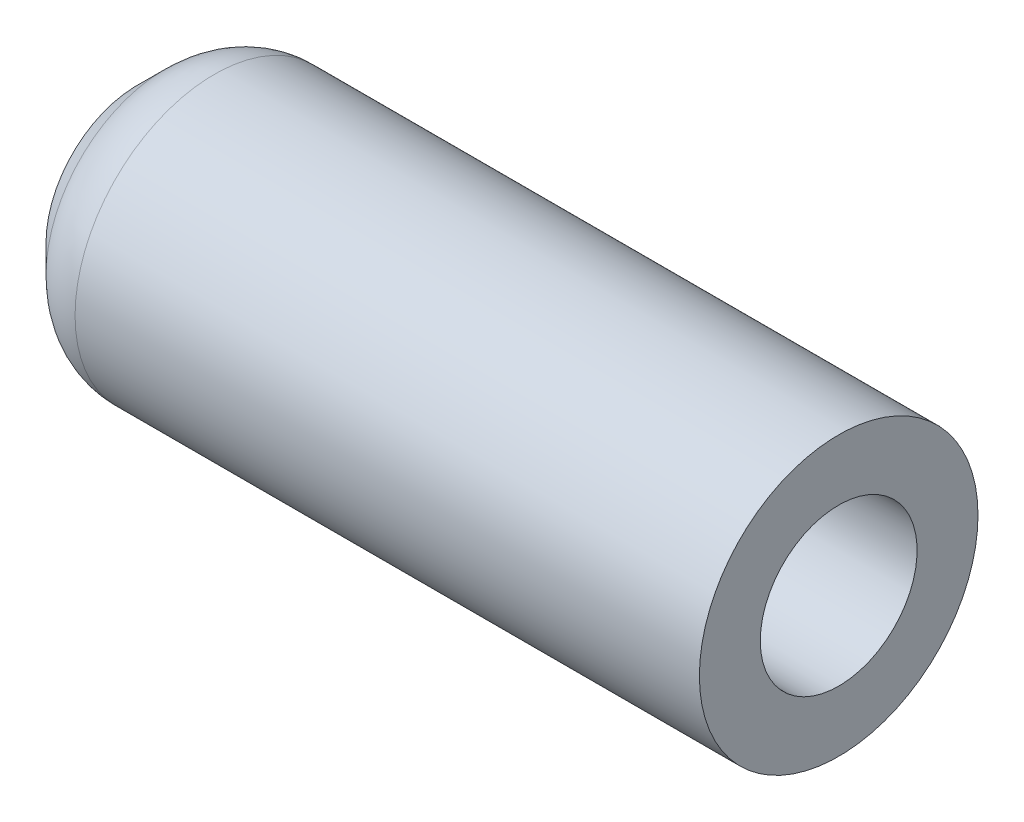
ISO-10303-21;
HEADER;
FILE_DESCRIPTION(('STEP AP214'),'2;1');
FILE_NAME('part.step','',(''),(''),'','','');
FILE_SCHEMA(('AUTOMOTIVE_DESIGN { 1 0 10303 214 1 1 1 1 }'));
ENDSEC;
DATA;
#1=APPLICATION_CONTEXT('core data for automotive mechanical design processes');
#2=APPLICATION_PROTOCOL_DEFINITION('international standard','automotive_design',2000,#1);
#3=PRODUCT_CONTEXT('',#1,'mechanical');
#4=PRODUCT('Part','Part','',(#3));
#5=PRODUCT_RELATED_PRODUCT_CATEGORY('part','',(#4));
#6=PRODUCT_DEFINITION_FORMATION('','',#4);
#7=PRODUCT_DEFINITION_CONTEXT('part definition',#1,'design');
#8=PRODUCT_DEFINITION('design','',#6,#7);
#9=PRODUCT_DEFINITION_SHAPE('','',#8);
#10=(LENGTH_UNIT() NAMED_UNIT(*) SI_UNIT(.MILLI.,.METRE.));
#11=(NAMED_UNIT(*) PLANE_ANGLE_UNIT() SI_UNIT($,.RADIAN.));
#12=(NAMED_UNIT(*) SI_UNIT($,.STERADIAN.) SOLID_ANGLE_UNIT());
#13=UNCERTAINTY_MEASURE_WITH_UNIT(LENGTH_MEASURE(1.E-05),#10,'distance_accuracy_value','');
#14=(GEOMETRIC_REPRESENTATION_CONTEXT(3) GLOBAL_UNCERTAINTY_ASSIGNED_CONTEXT((#13)) GLOBAL_UNIT_ASSIGNED_CONTEXT((#10,
#11,#12)) REPRESENTATION_CONTEXT('',''));
#15=CARTESIAN_POINT('',(0.,0.,0.));
#16=DIRECTION('',(0.,0.,1.));
#17=DIRECTION('',(1.,0.,0.));
#18=AXIS2_PLACEMENT_3D('',#15,#16,#17);
#19=CARTESIAN_POINT('',(0.,0.,0.));
#20=DIRECTION('',(1.,0.,0.));
#21=DIRECTION('',(0.,0.,-1.));
#22=AXIS2_PLACEMENT_3D('',#19,#20,#21);
#23=PLANE('',#22);
#24=CARTESIAN_POINT('',(0.,0.,0.));
#25=DIRECTION('',(-1.,0.,0.));
#26=DIRECTION('',(0.,0.,1.));
#27=AXIS2_PLACEMENT_3D('',#24,#25,#26);
#28=CIRCLE('',#27,2.413);
#29=CARTESIAN_POINT('',(0.,0.,2.413));
#30=VERTEX_POINT('',#29);
#31=EDGE_CURVE('E56',#30,#30,#28,.T.);
#32=ORIENTED_EDGE('',*,*,#31,.F.);
#33=EDGE_LOOP('',(#32));
#34=FACE_BOUND('',#33,.T.);
#35=CARTESIAN_POINT('',(0.,0.,0.));
#36=DIRECTION('',(-1.,0.,0.));
#37=DIRECTION('',(0.,0.,1.));
#38=AXIS2_PLACEMENT_3D('',#35,#36,#37);
#39=CIRCLE('',#38,2.8);
#40=CARTESIAN_POINT('',(0.,0.,2.8));
#41=VERTEX_POINT('',#40);
#42=EDGE_CURVE('E44',#41,#41,#39,.T.);
#43=ORIENTED_EDGE('',*,*,#42,.T.);
#44=EDGE_LOOP('',(#43));
#45=FACE_BOUND('',#44,.T.);
#46=ADVANCED_FACE('F33',(#34,#45),#23,.F.);
#47=CARTESIAN_POINT('',(1.48625000000001,0.,0.));
#48=DIRECTION('',(1.,0.,0.));
#49=DIRECTION('',(0.,0.,-1.));
#50=AXIS2_PLACEMENT_3D('',#47,#48,#49);
#51=CONICAL_SURFACE('',#50,4.28625,0.785398163397447);
#52=CARTESIAN_POINT('',(0.853893540581762,0.,0.));
#53=DIRECTION('',(-1.,0.,0.));
#54=DIRECTION('',(0.,0.,1.));
#55=AXIS2_PLACEMENT_3D('',#52,#53,#54);
#56=CIRCLE('',#55,3.65389354058176);
#57=CARTESIAN_POINT('',(0.853893540581762,0.,3.65389354058176));
#58=VERTEX_POINT('',#57);
#59=EDGE_CURVE('E40',#58,#58,#56,.T.);
#60=ORIENTED_EDGE('',*,*,#59,.T.);
#61=EDGE_LOOP('',(#60));
#62=FACE_BOUND('',#61,.T.);
#63=ORIENTED_EDGE('',*,*,#42,.F.);
#64=EDGE_LOOP('',(#63));
#65=FACE_BOUND('',#64,.T.);
#66=ADVANCED_FACE('F64',(#62,#65),#51,.T.);
#67=CARTESIAN_POINT('',(0.,0.,0.));
#68=DIRECTION('',(-1.,0.,0.));
#69=DIRECTION('',(0.,0.,1.));
#70=AXIS2_PLACEMENT_3D('',#67,#68,#69);
#71=CYLINDRICAL_SURFACE('',#70,4.28625);
#72=CARTESIAN_POINT('',(2.38053708116351,0.,0.));
#73=DIRECTION('',(1.,0.,0.));
#74=DIRECTION('',(0.,0.,-1.));
#75=AXIS2_PLACEMENT_3D('',#72,#73,#74);
#76=CIRCLE('',#75,4.28625);
#77=CARTESIAN_POINT('',(2.38053708116351,0.,-4.28625));
#78=VERTEX_POINT('',#77);
#79=EDGE_CURVE('E10',#78,#78,#76,.T.);
#80=ORIENTED_EDGE('',*,*,#79,.T.);
#81=EDGE_LOOP('',(#80));
#82=FACE_BOUND('',#81,.T.);
#83=CARTESIAN_POINT('',(21.59,0.,0.));
#84=DIRECTION('',(-1.,0.,0.));
#85=DIRECTION('',(0.,0.,1.));
#86=AXIS2_PLACEMENT_3D('',#83,#84,#85);
#87=CIRCLE('',#86,4.28625);
#88=CARTESIAN_POINT('',(21.59,0.,4.28625));
#89=VERTEX_POINT('',#88);
#90=EDGE_CURVE('E48',#89,#89,#87,.T.);
#91=ORIENTED_EDGE('',*,*,#90,.T.);
#92=EDGE_LOOP('',(#91));
#93=FACE_BOUND('',#92,.T.);
#94=ADVANCED_FACE('F68',(#82,#93),#71,.T.);
#95=CARTESIAN_POINT('',(21.59,4.28625,0.));
#96=DIRECTION('',(-1.,0.,0.));
#97=DIRECTION('',(0.,0.,1.));
#98=AXIS2_PLACEMENT_3D('',#95,#96,#97);
#99=PLANE('',#98);
#100=CARTESIAN_POINT('',(21.59,0.,0.));
#101=DIRECTION('',(-1.,0.,0.));
#102=DIRECTION('',(0.,0.,1.));
#103=AXIS2_PLACEMENT_3D('',#100,#101,#102);
#104=CIRCLE('',#103,2.413);
#105=CARTESIAN_POINT('',(21.59,0.,2.413));
#106=VERTEX_POINT('',#105);
#107=EDGE_CURVE('E53',#106,#106,#104,.F.);
#108=ORIENTED_EDGE('',*,*,#107,.F.);
#109=EDGE_LOOP('',(#108));
#110=FACE_BOUND('',#109,.T.);
#111=ORIENTED_EDGE('',*,*,#90,.F.);
#112=EDGE_LOOP('',(#111));
#113=FACE_BOUND('',#112,.T.);
#114=ADVANCED_FACE('F73',(#110,#113),#99,.F.);
#115=CARTESIAN_POINT('',(2.38053708116351,0.,0.));
#116=DIRECTION('',(1.,0.,0.));
#117=DIRECTION('',(0.,0.,-1.));
#118=AXIS2_PLACEMENT_3D('',#115,#116,#117);
#119=DEGENERATE_TOROIDAL_SURFACE('',#118,2.12725,2.159,.T.);
#120=ORIENTED_EDGE('',*,*,#79,.F.);
#121=EDGE_LOOP('',(#120));
#122=FACE_BOUND('',#121,.T.);
#123=ORIENTED_EDGE('',*,*,#59,.F.);
#124=EDGE_LOOP('',(#123));
#125=FACE_BOUND('',#124,.T.);
#126=ADVANCED_FACE('F35',(#122,#125),#119,.T.);
#127=CARTESIAN_POINT('',(28.4149946520126,0.,0.));
#128=DIRECTION('',(-1.,0.,0.));
#129=DIRECTION('',(0.,0.,1.));
#130=AXIS2_PLACEMENT_3D('',#127,#128,#129);
#131=CYLINDRICAL_SURFACE('',#130,2.413);
#132=ORIENTED_EDGE('',*,*,#107,.T.);
#133=EDGE_LOOP('',(#132));
#134=FACE_BOUND('',#133,.T.);
#135=ORIENTED_EDGE('',*,*,#31,.T.);
#136=EDGE_LOOP('',(#135));
#137=FACE_BOUND('',#136,.T.);
#138=ADVANCED_FACE('F60',(#134,#137),#131,.F.);
#139=CLOSED_SHELL('',(#46,#66,#94,#114,#126,#138));
#140=MANIFOLD_SOLID_BREP('B2',#139);
#141=ADVANCED_BREP_SHAPE_REPRESENTATION('',(#18,#140),#14);
#142=SHAPE_DEFINITION_REPRESENTATION(#9,#141);
ENDSEC;
END-ISO-10303-21;
